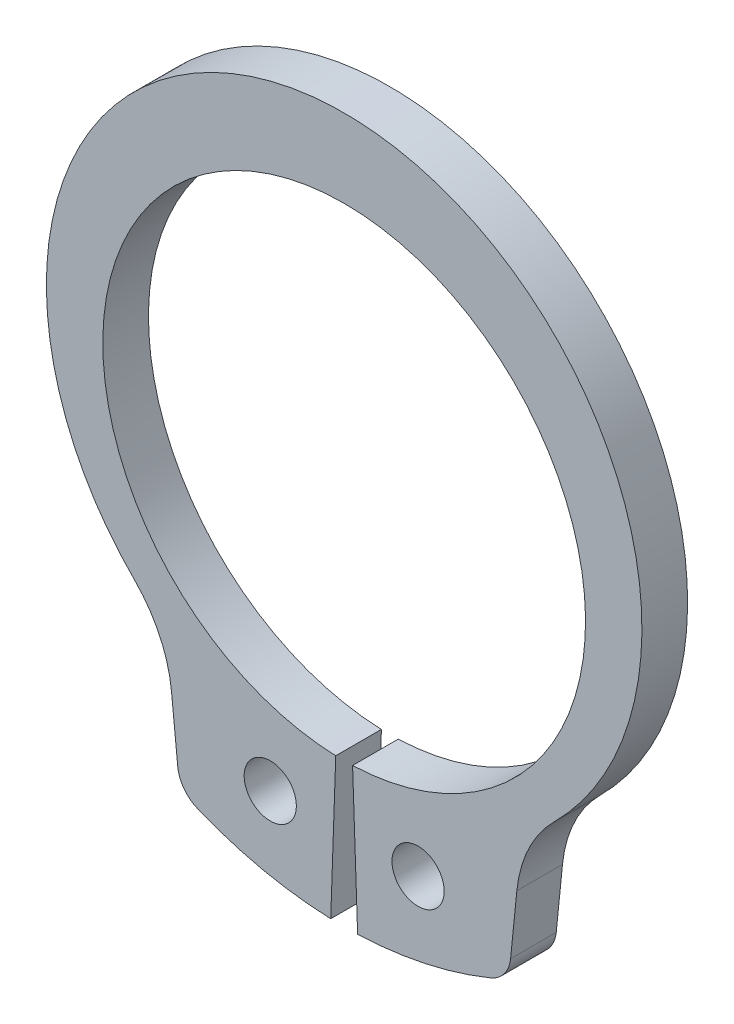
ISO-10303-21;
HEADER;
FILE_DESCRIPTION(('STEP AP214'),'2;1');
FILE_NAME('part.step','',(''),(''),'','','');
FILE_SCHEMA(('AUTOMOTIVE_DESIGN { 1 0 10303 214 1 1 1 1 }'));
ENDSEC;
DATA;
#1=APPLICATION_CONTEXT('core data for automotive mechanical design processes');
#2=APPLICATION_PROTOCOL_DEFINITION('international standard','automotive_design',2000,#1);
#3=PRODUCT_CONTEXT('',#1,'mechanical');
#4=PRODUCT('Part','Part','',(#3));
#5=PRODUCT_RELATED_PRODUCT_CATEGORY('part','',(#4));
#6=PRODUCT_DEFINITION_FORMATION('','',#4);
#7=PRODUCT_DEFINITION_CONTEXT('part definition',#1,'design');
#8=PRODUCT_DEFINITION('design','',#6,#7);
#9=PRODUCT_DEFINITION_SHAPE('','',#8);
#10=(LENGTH_UNIT() NAMED_UNIT(*) SI_UNIT(.MILLI.,.METRE.));
#11=(NAMED_UNIT(*) PLANE_ANGLE_UNIT() SI_UNIT($,.RADIAN.));
#12=(NAMED_UNIT(*) SI_UNIT($,.STERADIAN.) SOLID_ANGLE_UNIT());
#13=UNCERTAINTY_MEASURE_WITH_UNIT(LENGTH_MEASURE(1.E-05),#10,'distance_accuracy_value','');
#14=(GEOMETRIC_REPRESENTATION_CONTEXT(3) GLOBAL_UNCERTAINTY_ASSIGNED_CONTEXT((#13)) GLOBAL_UNIT_ASSIGNED_CONTEXT((#10,
#11,#12)) REPRESENTATION_CONTEXT('',''));
#15=CARTESIAN_POINT('',(0.,0.,0.));
#16=DIRECTION('',(0.,0.,1.));
#17=DIRECTION('',(1.,0.,0.));
#18=AXIS2_PLACEMENT_3D('',#15,#16,#17);
#19=CARTESIAN_POINT('',(0.,0.838766754426005,0.875));
#20=DIRECTION('',(0.,0.,1.));
#21=DIRECTION('',(1.,0.,0.));
#22=AXIS2_PLACEMENT_3D('',#19,#20,#21);
#23=PLANE('',#22);
#24=DIRECTION('',(0.100265930372946,-0.994960674200969,0.));
#25=VECTOR('',#24,1.);
#26=CARTESIAN_POINT('',(-6.3056380264349,-13.3441649374061,0.875));
#27=LINE('',#26,#25);
#28=CARTESIAN_POINT('',(-6.61692351886447,-10.2552111695141,0.875));
#29=VERTEX_POINT('',#28);
#30=CARTESIAN_POINT('',(-6.37754803138788,-12.6305862896672,0.875));
#31=VERTEX_POINT('',#30);
#32=EDGE_CURVE('E220',#29,#31,#27,.T.);
#33=ORIENTED_EDGE('',*,*,#32,.T.);
#34=CARTESIAN_POINT('',(-5.15089558380588,-12.5069719076216,0.875));
#35=DIRECTION('',(0.,0.,1.));
#36=DIRECTION('',(1.,0.,0.));
#37=AXIS2_PLACEMENT_3D('',#34,#35,#36);
#38=CIRCLE('',#37,1.23286525727974);
#39=CARTESIAN_POINT('',(-5.62038407104715,-13.6469444085861,0.875));
#40=VERTEX_POINT('',#39);
#41=EDGE_CURVE('E12',#31,#40,#38,.T.);
#42=ORIENTED_EDGE('',*,*,#41,.T.);
#43=CARTESIAN_POINT('',(0.,0.,0.875));
#44=DIRECTION('',(0.,0.,1.));
#45=DIRECTION('',(1.,0.,0.));
#46=AXIS2_PLACEMENT_3D('',#43,#44,#45);
#47=CIRCLE('',#46,14.7589907784076);
#48=CARTESIAN_POINT('',(-0.515081350003302,-14.75,0.875));
#49=VERTEX_POINT('',#48);
#50=EDGE_CURVE('E224',#40,#49,#47,.T.);
#51=ORIENTED_EDGE('',*,*,#50,.T.);
#52=DIRECTION('',(0.0348994967025028,0.999390827019096,0.));
#53=VECTOR('',#52,1.);
#54=CARTESIAN_POINT('',(-0.515081350003302,-14.75,0.875));
#55=LINE('',#54,#53);
#56=CARTESIAN_POINT('',(-0.322820344498148,-9.24436514992663,0.875));
#57=VERTEX_POINT('',#56);
#58=EDGE_CURVE('E227',#49,#57,#55,.T.);
#59=ORIENTED_EDGE('',*,*,#58,.T.);
#60=CARTESIAN_POINT('',(0.,0.,0.875));
#61=DIRECTION('',(0.,0.,-1.));
#62=DIRECTION('',(1.,0.,0.));
#63=AXIS2_PLACEMENT_3D('',#60,#61,#62);
#64=CIRCLE('',#63,9.25);
#65=CARTESIAN_POINT('',(0.322820344498144,-9.24436514992663,0.875));
#66=VERTEX_POINT('',#65);
#67=EDGE_CURVE('E162',#57,#66,#64,.T.);
#68=ORIENTED_EDGE('',*,*,#67,.T.);
#69=DIRECTION('',(-0.0348994967025024,0.999390827019096,0.));
#70=VECTOR('',#69,1.);
#71=CARTESIAN_POINT('',(0.515081350003295,-14.75,0.875));
#72=LINE('',#71,#70);
#73=CARTESIAN_POINT('',(0.515081350003295,-14.75,0.875));
#74=VERTEX_POINT('',#73);
#75=EDGE_CURVE('E140',#74,#66,#72,.T.);
#76=ORIENTED_EDGE('',*,*,#75,.F.);
#77=CARTESIAN_POINT('',(0.,0.,0.875));
#78=DIRECTION('',(0.,0.,-1.));
#79=DIRECTION('',(-1.,0.,0.));
#80=AXIS2_PLACEMENT_3D('',#77,#78,#79);
#81=CIRCLE('',#80,14.7589907784076);
#82=CARTESIAN_POINT('',(5.62038407104714,-13.6469444085861,0.875));
#83=VERTEX_POINT('',#82);
#84=EDGE_CURVE('E151',#83,#74,#81,.T.);
#85=ORIENTED_EDGE('',*,*,#84,.F.);
#86=CARTESIAN_POINT('',(5.15089558380587,-12.5069719076216,0.875));
#87=DIRECTION('',(0.,0.,-1.));
#88=DIRECTION('',(-1.,0.,0.));
#89=AXIS2_PLACEMENT_3D('',#86,#87,#88);
#90=CIRCLE('',#89,1.23286525727974);
#91=CARTESIAN_POINT('',(6.37754803138787,-12.6305862896672,0.875));
#92=VERTEX_POINT('',#91);
#93=EDGE_CURVE('E204',#92,#83,#90,.T.);
#94=ORIENTED_EDGE('',*,*,#93,.F.);
#95=DIRECTION('',(-0.100265930372947,-0.994960674200969,0.));
#96=VECTOR('',#95,1.);
#97=CARTESIAN_POINT('',(6.30563802643489,-13.3441649374061,0.875));
#98=LINE('',#97,#96);
#99=CARTESIAN_POINT('',(6.61692351886447,-10.2552111695141,0.875));
#100=VERTEX_POINT('',#99);
#101=EDGE_CURVE('E158',#100,#92,#98,.T.);
#102=ORIENTED_EDGE('',*,*,#101,.F.);
#103=CARTESIAN_POINT('',(11.5235333091925,-10.7496686976967,0.875));
#104=DIRECTION('',(0.,0.,-1.));
#105=DIRECTION('',(-1.,0.,0.));
#106=AXIS2_PLACEMENT_3D('',#103,#104,#105);
#107=CIRCLE('',#106,4.93146102911895);
#108=CARTESIAN_POINT('',(8.04626973949845,-7.25282069576725,0.875));
#109=VERTEX_POINT('',#108);
#110=EDGE_CURVE('E191',#109,#100,#107,.F.);
#111=ORIENTED_EDGE('',*,*,#110,.F.);
#112=CARTESIAN_POINT('',(0.,0.838766754426005,0.875));
#113=DIRECTION('',(0.,0.,1.));
#114=DIRECTION('',(1.,0.,0.));
#115=AXIS2_PLACEMENT_3D('',#112,#113,#114);
#116=CIRCLE('',#115,11.411233245574);
#117=CARTESIAN_POINT('',(-8.04626973949845,-7.25282069576725,0.875));
#118=VERTEX_POINT('',#117);
#119=EDGE_CURVE('E216',#109,#118,#116,.T.);
#120=ORIENTED_EDGE('',*,*,#119,.T.);
#121=CARTESIAN_POINT('',(-11.5235333091925,-10.7496686976967,0.875));
#122=DIRECTION('',(0.,0.,1.));
#123=DIRECTION('',(1.,0.,0.));
#124=AXIS2_PLACEMENT_3D('',#121,#122,#123);
#125=CIRCLE('',#124,4.93146102911895);
#126=EDGE_CURVE('E264',#118,#29,#125,.F.);
#127=ORIENTED_EDGE('',*,*,#126,.T.);
#128=EDGE_LOOP('',(#33,#42,#51,#59,#68,#76,#85,#94,#102,#111,#120,#127));
#129=FACE_BOUND('',#128,.T.);
#130=CARTESIAN_POINT('',(-2.83218609433894,-11.6656174922911,0.875));
#131=DIRECTION('',(0.,0.,1.));
#132=DIRECTION('',(1.,0.,0.));
#133=AXIS2_PLACEMENT_3D('',#130,#131,#132);
#134=CIRCLE('',#133,1.);
#135=CARTESIAN_POINT('',(-1.83218609433894,-11.6656174922911,0.875));
#136=VERTEX_POINT('',#135);
#137=EDGE_CURVE('E208',#136,#136,#134,.T.);
#138=ORIENTED_EDGE('',*,*,#137,.F.);
#139=EDGE_LOOP('',(#138));
#140=FACE_BOUND('',#139,.T.);
#141=CARTESIAN_POINT('',(2.83218609433893,-11.6656174922911,0.875));
#142=DIRECTION('',(0.,0.,-1.));
#143=DIRECTION('',(-1.,0.,0.));
#144=AXIS2_PLACEMENT_3D('',#141,#142,#143);
#145=CIRCLE('',#144,1.);
#146=CARTESIAN_POINT('',(1.83218609433893,-11.6656174922911,0.875));
#147=VERTEX_POINT('',#146);
#148=EDGE_CURVE('E176',#147,#147,#145,.T.);
#149=ORIENTED_EDGE('',*,*,#148,.T.);
#150=EDGE_LOOP('',(#149));
#151=FACE_BOUND('',#150,.T.);
#152=ADVANCED_FACE('F45',(#129,#140,#151),#23,.T.);
#153=CARTESIAN_POINT('',(0.,0.838766754426005,-0.875));
#154=DIRECTION('',(0.,0.,1.));
#155=DIRECTION('',(1.,0.,0.));
#156=AXIS2_PLACEMENT_3D('',#153,#154,#155);
#157=PLANE('',#156);
#158=CARTESIAN_POINT('',(0.,0.,-0.875));
#159=DIRECTION('',(0.,0.,1.));
#160=DIRECTION('',(1.,0.,0.));
#161=AXIS2_PLACEMENT_3D('',#158,#159,#160);
#162=CIRCLE('',#161,14.7589907784076);
#163=CARTESIAN_POINT('',(-5.62038407104715,-13.6469444085861,-0.875));
#164=VERTEX_POINT('',#163);
#165=CARTESIAN_POINT('',(-0.515081350003302,-14.75,-0.875));
#166=VERTEX_POINT('',#165);
#167=EDGE_CURVE('E239',#164,#166,#162,.T.);
#168=ORIENTED_EDGE('',*,*,#167,.F.);
#169=CARTESIAN_POINT('',(-5.15089558380588,-12.5069719076216,-0.875));
#170=DIRECTION('',(0.,0.,1.));
#171=DIRECTION('',(1.,0.,0.));
#172=AXIS2_PLACEMENT_3D('',#169,#170,#171);
#173=CIRCLE('',#172,1.23286525727974);
#174=CARTESIAN_POINT('',(-6.37754803138788,-12.6305862896672,-0.875));
#175=VERTEX_POINT('',#174);
#176=EDGE_CURVE('E68',#164,#175,#173,.F.);
#177=ORIENTED_EDGE('',*,*,#176,.T.);
#178=DIRECTION('',(0.100265930372946,-0.994960674200969,0.));
#179=VECTOR('',#178,1.);
#180=CARTESIAN_POINT('',(-6.3056380264349,-13.3441649374061,-0.875));
#181=LINE('',#180,#179);
#182=CARTESIAN_POINT('',(-6.61692351886447,-10.2552111695141,-0.875));
#183=VERTEX_POINT('',#182);
#184=EDGE_CURVE('E236',#183,#175,#181,.T.);
#185=ORIENTED_EDGE('',*,*,#184,.F.);
#186=CARTESIAN_POINT('',(-11.5235333091925,-10.7496686976967,-0.875));
#187=DIRECTION('',(0.,0.,1.));
#188=DIRECTION('',(1.,0.,0.));
#189=AXIS2_PLACEMENT_3D('',#186,#187,#188);
#190=CIRCLE('',#189,4.93146102911895);
#191=CARTESIAN_POINT('',(-8.04626973949845,-7.25282069576725,-0.875));
#192=VERTEX_POINT('',#191);
#193=EDGE_CURVE('E261',#183,#192,#190,.T.);
#194=ORIENTED_EDGE('',*,*,#193,.T.);
#195=CARTESIAN_POINT('',(0.,0.838766754426005,-0.875));
#196=DIRECTION('',(0.,0.,1.));
#197=DIRECTION('',(1.,0.,0.));
#198=AXIS2_PLACEMENT_3D('',#195,#196,#197);
#199=CIRCLE('',#198,11.411233245574);
#200=CARTESIAN_POINT('',(8.04626973949845,-7.25282069576725,-0.875));
#201=VERTEX_POINT('',#200);
#202=EDGE_CURVE('E212',#201,#192,#199,.T.);
#203=ORIENTED_EDGE('',*,*,#202,.F.);
#204=CARTESIAN_POINT('',(11.5235333091925,-10.7496686976967,-0.875));
#205=DIRECTION('',(0.,0.,-1.));
#206=DIRECTION('',(-1.,0.,0.));
#207=AXIS2_PLACEMENT_3D('',#204,#205,#206);
#208=CIRCLE('',#207,4.93146102911895);
#209=CARTESIAN_POINT('',(6.61692351886447,-10.2552111695141,-0.875));
#210=VERTEX_POINT('',#209);
#211=EDGE_CURVE('E187',#210,#201,#208,.T.);
#212=ORIENTED_EDGE('',*,*,#211,.F.);
#213=DIRECTION('',(-0.100265930372947,-0.994960674200969,0.));
#214=VECTOR('',#213,1.);
#215=CARTESIAN_POINT('',(6.30563802643489,-13.3441649374061,-0.875));
#216=LINE('',#215,#214);
#217=CARTESIAN_POINT('',(6.37754803138787,-12.6305862896672,-0.875));
#218=VERTEX_POINT('',#217);
#219=EDGE_CURVE('E171',#210,#218,#216,.T.);
#220=ORIENTED_EDGE('',*,*,#219,.T.);
#221=CARTESIAN_POINT('',(5.15089558380587,-12.5069719076216,-0.875));
#222=DIRECTION('',(0.,0.,-1.));
#223=DIRECTION('',(-1.,0.,0.));
#224=AXIS2_PLACEMENT_3D('',#221,#222,#223);
#225=CIRCLE('',#224,1.23286525727974);
#226=CARTESIAN_POINT('',(5.62038407104714,-13.6469444085861,-0.875));
#227=VERTEX_POINT('',#226);
#228=EDGE_CURVE('E197',#227,#218,#225,.F.);
#229=ORIENTED_EDGE('',*,*,#228,.F.);
#230=CARTESIAN_POINT('',(0.,0.,-0.875));
#231=DIRECTION('',(0.,0.,-1.));
#232=DIRECTION('',(-1.,0.,0.));
#233=AXIS2_PLACEMENT_3D('',#230,#231,#232);
#234=CIRCLE('',#233,14.7589907784076);
#235=CARTESIAN_POINT('',(0.515081350003295,-14.75,-0.875));
#236=VERTEX_POINT('',#235);
#237=EDGE_CURVE('E175',#227,#236,#234,.T.);
#238=ORIENTED_EDGE('',*,*,#237,.T.);
#239=DIRECTION('',(-0.0348994967025024,0.999390827019096,0.));
#240=VECTOR('',#239,1.);
#241=CARTESIAN_POINT('',(0.515081350003295,-14.75,-0.875));
#242=LINE('',#241,#240);
#243=CARTESIAN_POINT('',(0.322820344498144,-9.24436514992663,-0.875));
#244=VERTEX_POINT('',#243);
#245=EDGE_CURVE('E142',#236,#244,#242,.T.);
#246=ORIENTED_EDGE('',*,*,#245,.T.);
#247=CARTESIAN_POINT('',(0.,0.,-0.875));
#248=DIRECTION('',(0.,0.,-1.));
#249=DIRECTION('',(1.,0.,0.));
#250=AXIS2_PLACEMENT_3D('',#247,#248,#249);
#251=CIRCLE('',#250,9.25);
#252=CARTESIAN_POINT('',(-0.322820344498148,-9.24436514992663,-0.875));
#253=VERTEX_POINT('',#252);
#254=EDGE_CURVE('E221',#253,#244,#251,.T.);
#255=ORIENTED_EDGE('',*,*,#254,.F.);
#256=DIRECTION('',(0.0348994967025028,0.999390827019096,0.));
#257=VECTOR('',#256,1.);
#258=CARTESIAN_POINT('',(-0.515081350003302,-14.75,-0.875));
#259=LINE('',#258,#257);
#260=EDGE_CURVE('E242',#166,#253,#259,.T.);
#261=ORIENTED_EDGE('',*,*,#260,.F.);
#262=EDGE_LOOP('',(#168,#177,#185,#194,#203,#212,#220,#229,#238,#246,#255,#261));
#263=FACE_BOUND('',#262,.T.);
#264=CARTESIAN_POINT('',(-2.83218609433894,-11.6656174922911,-0.875));
#265=DIRECTION('',(0.,0.,1.));
#266=DIRECTION('',(1.,0.,0.));
#267=AXIS2_PLACEMENT_3D('',#264,#265,#266);
#268=CIRCLE('',#267,1.);
#269=CARTESIAN_POINT('',(-1.83218609433894,-11.6656174922911,-0.875));
#270=VERTEX_POINT('',#269);
#271=EDGE_CURVE('E207',#270,#270,#268,.T.);
#272=ORIENTED_EDGE('',*,*,#271,.T.);
#273=EDGE_LOOP('',(#272));
#274=FACE_BOUND('',#273,.T.);
#275=CARTESIAN_POINT('',(2.83218609433893,-11.6656174922911,-0.875));
#276=DIRECTION('',(0.,0.,-1.));
#277=DIRECTION('',(-1.,0.,0.));
#278=AXIS2_PLACEMENT_3D('',#275,#276,#277);
#279=CIRCLE('',#278,1.);
#280=CARTESIAN_POINT('',(1.83218609433893,-11.6656174922911,-0.875));
#281=VERTEX_POINT('',#280);
#282=EDGE_CURVE('E335',#281,#281,#279,.T.);
#283=ORIENTED_EDGE('',*,*,#282,.F.);
#284=EDGE_LOOP('',(#283));
#285=FACE_BOUND('',#284,.T.);
#286=ADVANCED_FACE('F313',(#263,#274,#285),#157,.F.);
#287=CARTESIAN_POINT('',(0.,0.838766754426005,0.875));
#288=DIRECTION('',(0.,0.,-1.));
#289=DIRECTION('',(-1.,0.,0.));
#290=AXIS2_PLACEMENT_3D('',#287,#288,#289);
#291=CYLINDRICAL_SURFACE('',#290,11.411233245574);
#292=ORIENTED_EDGE('',*,*,#202,.T.);
#293=DIRECTION('',(0.,0.,-1.));
#294=VECTOR('',#293,1.);
#295=CARTESIAN_POINT('',(-8.04626973949845,-7.25282069576725,0.875));
#296=LINE('',#295,#294);
#297=EDGE_CURVE('E258',#192,#118,#296,.F.);
#298=ORIENTED_EDGE('',*,*,#297,.T.);
#299=ORIENTED_EDGE('',*,*,#119,.F.);
#300=DIRECTION('',(0.,0.,-1.));
#301=VECTOR('',#300,1.);
#302=CARTESIAN_POINT('',(8.04626973949845,-7.25282069576725,0.875));
#303=LINE('',#302,#301);
#304=EDGE_CURVE('E183',#201,#109,#303,.F.);
#305=ORIENTED_EDGE('',*,*,#304,.F.);
#306=EDGE_LOOP('',(#292,#298,#299,#305));
#307=FACE_BOUND('',#306,.T.);
#308=ADVANCED_FACE('F353',(#307),#291,.T.);
#309=CARTESIAN_POINT('',(-6.3056380264349,-13.3441649374061,0.875));
#310=DIRECTION('',(0.994960674200969,0.100265930372946,0.));
#311=DIRECTION('',(-0.100265930372946,0.994960674200969,0.));
#312=AXIS2_PLACEMENT_3D('',#309,#310,#311);
#313=PLANE('',#312);
#314=ORIENTED_EDGE('',*,*,#184,.T.);
#315=DIRECTION('',(0.,0.,-1.));
#316=VECTOR('',#315,1.);
#317=CARTESIAN_POINT('',(-6.37754803138788,-12.6305862896672,0.875));
#318=LINE('',#317,#316);
#319=EDGE_CURVE('E54',#175,#31,#318,.F.);
#320=ORIENTED_EDGE('',*,*,#319,.T.);
#321=ORIENTED_EDGE('',*,*,#32,.F.);
#322=DIRECTION('',(0.,0.,1.));
#323=VECTOR('',#322,1.);
#324=CARTESIAN_POINT('',(-6.61692351886447,-10.2552111695141,-0.875));
#325=LINE('',#324,#323);
#326=EDGE_CURVE('E254',#29,#183,#325,.F.);
#327=ORIENTED_EDGE('',*,*,#326,.T.);
#328=EDGE_LOOP('',(#314,#320,#321,#327));
#329=FACE_BOUND('',#328,.T.);
#330=ADVANCED_FACE('F359',(#329),#313,.F.);
#331=CARTESIAN_POINT('',(0.,0.,0.875));
#332=DIRECTION('',(0.,0.,-1.));
#333=DIRECTION('',(-1.,0.,0.));
#334=AXIS2_PLACEMENT_3D('',#331,#332,#333);
#335=CYLINDRICAL_SURFACE('',#334,14.7589907784076);
#336=ORIENTED_EDGE('',*,*,#50,.F.);
#337=DIRECTION('',(0.,0.,-1.));
#338=VECTOR('',#337,1.);
#339=CARTESIAN_POINT('',(-5.62038407104715,-13.6469444085861,0.875));
#340=LINE('',#339,#338);
#341=EDGE_CURVE('E267',#40,#164,#340,.T.);
#342=ORIENTED_EDGE('',*,*,#341,.T.);
#343=ORIENTED_EDGE('',*,*,#167,.T.);
#344=DIRECTION('',(0.,0.,-1.));
#345=VECTOR('',#344,1.);
#346=CARTESIAN_POINT('',(-0.515081350003302,-14.75,0.875));
#347=LINE('',#346,#345);
#348=EDGE_CURVE('E250',#49,#166,#347,.T.);
#349=ORIENTED_EDGE('',*,*,#348,.F.);
#350=EDGE_LOOP('',(#336,#342,#343,#349));
#351=FACE_BOUND('',#350,.T.);
#352=ADVANCED_FACE('F308',(#351),#335,.T.);
#353=CARTESIAN_POINT('',(-0.515081350003302,-14.75,0.875));
#354=DIRECTION('',(-0.999390827019096,0.0348994967025028,0.));
#355=DIRECTION('',(-0.0348994967025028,-0.999390827019096,0.));
#356=AXIS2_PLACEMENT_3D('',#353,#354,#355);
#357=PLANE('',#356);
#358=ORIENTED_EDGE('',*,*,#260,.T.);
#359=DIRECTION('',(0.,0.,-1.));
#360=VECTOR('',#359,1.);
#361=CARTESIAN_POINT('',(-0.322820344498148,-9.24436514992663,0.875));
#362=LINE('',#361,#360);
#363=EDGE_CURVE('E232',#57,#253,#362,.T.);
#364=ORIENTED_EDGE('',*,*,#363,.F.);
#365=ORIENTED_EDGE('',*,*,#58,.F.);
#366=ORIENTED_EDGE('',*,*,#348,.T.);
#367=EDGE_LOOP('',(#358,#364,#365,#366));
#368=FACE_BOUND('',#367,.T.);
#369=ADVANCED_FACE('F318',(#368),#357,.F.);
#370=CARTESIAN_POINT('',(0.,0.,0.875));
#371=DIRECTION('',(0.,0.,-1.));
#372=DIRECTION('',(-1.,0.,0.));
#373=AXIS2_PLACEMENT_3D('',#370,#371,#372);
#374=CYLINDRICAL_SURFACE('',#373,9.25);
#375=ORIENTED_EDGE('',*,*,#254,.T.);
#376=DIRECTION('',(0.,0.,-1.));
#377=VECTOR('',#376,1.);
#378=CARTESIAN_POINT('',(0.322820344498144,-9.24436514992663,0.875));
#379=LINE('',#378,#377);
#380=EDGE_CURVE('E148',#66,#244,#379,.T.);
#381=ORIENTED_EDGE('',*,*,#380,.F.);
#382=ORIENTED_EDGE('',*,*,#67,.F.);
#383=ORIENTED_EDGE('',*,*,#363,.T.);
#384=EDGE_LOOP('',(#375,#381,#382,#383));
#385=FACE_BOUND('',#384,.T.);
#386=ADVANCED_FACE('F321',(#385),#374,.F.);
#387=CARTESIAN_POINT('',(-2.83218609433894,-11.6656174922911,0.875));
#388=DIRECTION('',(0.,0.,-1.));
#389=DIRECTION('',(-1.,0.,0.));
#390=AXIS2_PLACEMENT_3D('',#387,#388,#389);
#391=CYLINDRICAL_SURFACE('',#390,1.);
#392=ORIENTED_EDGE('',*,*,#137,.T.);
#393=EDGE_LOOP('',(#392));
#394=FACE_BOUND('',#393,.T.);
#395=ORIENTED_EDGE('',*,*,#271,.F.);
#396=EDGE_LOOP('',(#395));
#397=FACE_BOUND('',#396,.T.);
#398=ADVANCED_FACE('F367',(#394,#397),#391,.F.);
#399=CARTESIAN_POINT('',(-11.5235333091925,-10.7496686976967,0.875));
#400=DIRECTION('',(0.,0.,-1.));
#401=DIRECTION('',(-1.,0.,0.));
#402=AXIS2_PLACEMENT_3D('',#399,#400,#401);
#403=CYLINDRICAL_SURFACE('',#402,4.93146102911895);
#404=ORIENTED_EDGE('',*,*,#126,.F.);
#405=ORIENTED_EDGE('',*,*,#297,.F.);
#406=ORIENTED_EDGE('',*,*,#193,.F.);
#407=ORIENTED_EDGE('',*,*,#326,.F.);
#408=EDGE_LOOP('',(#404,#405,#406,#407));
#409=FACE_BOUND('',#408,.T.);
#410=ADVANCED_FACE('F373',(#409),#403,.F.);
#411=CARTESIAN_POINT('',(-5.15089558380588,-12.5069719076216,0.875));
#412=DIRECTION('',(0.,0.,-1.));
#413=DIRECTION('',(-1.,0.,0.));
#414=AXIS2_PLACEMENT_3D('',#411,#412,#413);
#415=CYLINDRICAL_SURFACE('',#414,1.23286525727974);
#416=ORIENTED_EDGE('',*,*,#41,.F.);
#417=ORIENTED_EDGE('',*,*,#319,.F.);
#418=ORIENTED_EDGE('',*,*,#176,.F.);
#419=ORIENTED_EDGE('',*,*,#341,.F.);
#420=EDGE_LOOP('',(#416,#417,#418,#419));
#421=FACE_BOUND('',#420,.T.);
#422=ADVANCED_FACE('F47',(#421),#415,.T.);
#423=CARTESIAN_POINT('',(6.30563802643489,-13.3441649374061,0.875));
#424=DIRECTION('',(-0.994960674200969,0.100265930372947,0.));
#425=DIRECTION('',(0.100265930372947,0.994960674200969,0.));
#426=AXIS2_PLACEMENT_3D('',#423,#424,#425);
#427=PLANE('',#426);
#428=ORIENTED_EDGE('',*,*,#219,.F.);
#429=DIRECTION('',(0.,0.,1.));
#430=VECTOR('',#429,1.);
#431=CARTESIAN_POINT('',(6.61692351886447,-10.2552111695141,-0.875));
#432=LINE('',#431,#430);
#433=EDGE_CURVE('E147',#100,#210,#432,.F.);
#434=ORIENTED_EDGE('',*,*,#433,.F.);
#435=ORIENTED_EDGE('',*,*,#101,.T.);
#436=DIRECTION('',(0.,0.,-1.));
#437=VECTOR('',#436,1.);
#438=CARTESIAN_POINT('',(6.37754803138787,-12.6305862896672,0.875));
#439=LINE('',#438,#437);
#440=EDGE_CURVE('E201',#218,#92,#439,.F.);
#441=ORIENTED_EDGE('',*,*,#440,.F.);
#442=EDGE_LOOP('',(#428,#434,#435,#441));
#443=FACE_BOUND('',#442,.T.);
#444=ADVANCED_FACE('F331',(#443),#427,.F.);
#445=CARTESIAN_POINT('',(0.,0.,0.875));
#446=DIRECTION('',(0.,0.,-1.));
#447=DIRECTION('',(1.,0.,0.));
#448=AXIS2_PLACEMENT_3D('',#445,#446,#447);
#449=CYLINDRICAL_SURFACE('',#448,14.7589907784076);
#450=ORIENTED_EDGE('',*,*,#84,.T.);
#451=DIRECTION('',(0.,0.,-1.));
#452=VECTOR('',#451,1.);
#453=CARTESIAN_POINT('',(0.515081350003295,-14.75,0.875));
#454=LINE('',#453,#452);
#455=EDGE_CURVE('E135',#74,#236,#454,.T.);
#456=ORIENTED_EDGE('',*,*,#455,.T.);
#457=ORIENTED_EDGE('',*,*,#237,.F.);
#458=DIRECTION('',(0.,0.,-1.));
#459=VECTOR('',#458,1.);
#460=CARTESIAN_POINT('',(5.62038407104714,-13.6469444085862,0.875));
#461=LINE('',#460,#459);
#462=EDGE_CURVE('E153',#83,#227,#461,.T.);
#463=ORIENTED_EDGE('',*,*,#462,.F.);
#464=EDGE_LOOP('',(#450,#456,#457,#463));
#465=FACE_BOUND('',#464,.T.);
#466=ADVANCED_FACE('F152',(#465),#449,.T.);
#467=CARTESIAN_POINT('',(0.515081350003295,-14.75,0.875));
#468=DIRECTION('',(0.999390827019096,0.0348994967025024,0.));
#469=DIRECTION('',(0.0348994967025024,-0.999390827019096,0.));
#470=AXIS2_PLACEMENT_3D('',#467,#468,#469);
#471=PLANE('',#470);
#472=ORIENTED_EDGE('',*,*,#245,.F.);
#473=ORIENTED_EDGE('',*,*,#455,.F.);
#474=ORIENTED_EDGE('',*,*,#75,.T.);
#475=ORIENTED_EDGE('',*,*,#380,.T.);
#476=EDGE_LOOP('',(#472,#473,#474,#475));
#477=FACE_BOUND('',#476,.T.);
#478=ADVANCED_FACE('F137',(#477),#471,.F.);
#479=CARTESIAN_POINT('',(2.83218609433893,-11.6656174922911,0.875));
#480=DIRECTION('',(0.,0.,-1.));
#481=DIRECTION('',(1.,0.,0.));
#482=AXIS2_PLACEMENT_3D('',#479,#480,#481);
#483=CYLINDRICAL_SURFACE('',#482,1.);
#484=ORIENTED_EDGE('',*,*,#148,.F.);
#485=EDGE_LOOP('',(#484));
#486=FACE_BOUND('',#485,.T.);
#487=ORIENTED_EDGE('',*,*,#282,.T.);
#488=EDGE_LOOP('',(#487));
#489=FACE_BOUND('',#488,.T.);
#490=ADVANCED_FACE('F345',(#486,#489),#483,.F.);
#491=CARTESIAN_POINT('',(11.5235333091925,-10.7496686976967,0.875));
#492=DIRECTION('',(0.,0.,-1.));
#493=DIRECTION('',(1.,0.,0.));
#494=AXIS2_PLACEMENT_3D('',#491,#492,#493);
#495=CYLINDRICAL_SURFACE('',#494,4.93146102911895);
#496=ORIENTED_EDGE('',*,*,#110,.T.);
#497=ORIENTED_EDGE('',*,*,#433,.T.);
#498=ORIENTED_EDGE('',*,*,#211,.T.);
#499=ORIENTED_EDGE('',*,*,#304,.T.);
#500=EDGE_LOOP('',(#496,#497,#498,#499));
#501=FACE_BOUND('',#500,.T.);
#502=ADVANCED_FACE('F348',(#501),#495,.F.);
#503=CARTESIAN_POINT('',(5.15089558380587,-12.5069719076216,0.875));
#504=DIRECTION('',(0.,0.,-1.));
#505=DIRECTION('',(1.,0.,0.));
#506=AXIS2_PLACEMENT_3D('',#503,#504,#505);
#507=CYLINDRICAL_SURFACE('',#506,1.23286525727974);
#508=ORIENTED_EDGE('',*,*,#93,.T.);
#509=ORIENTED_EDGE('',*,*,#462,.T.);
#510=ORIENTED_EDGE('',*,*,#228,.T.);
#511=ORIENTED_EDGE('',*,*,#440,.T.);
#512=EDGE_LOOP('',(#508,#509,#510,#511));
#513=FACE_BOUND('',#512,.T.);
#514=ADVANCED_FACE('F326',(#513),#507,.T.);
#515=CLOSED_SHELL('',(#152,#286,#308,#330,#352,#369,#386,#398,#410,#422,#444,#466,#478,#490,
#502,#514));
#516=MANIFOLD_SOLID_BREP('B2',#515);
#517=ADVANCED_BREP_SHAPE_REPRESENTATION('',(#18,#516),#14);
#518=SHAPE_DEFINITION_REPRESENTATION(#9,#517);
ENDSEC;
END-ISO-10303-21;
